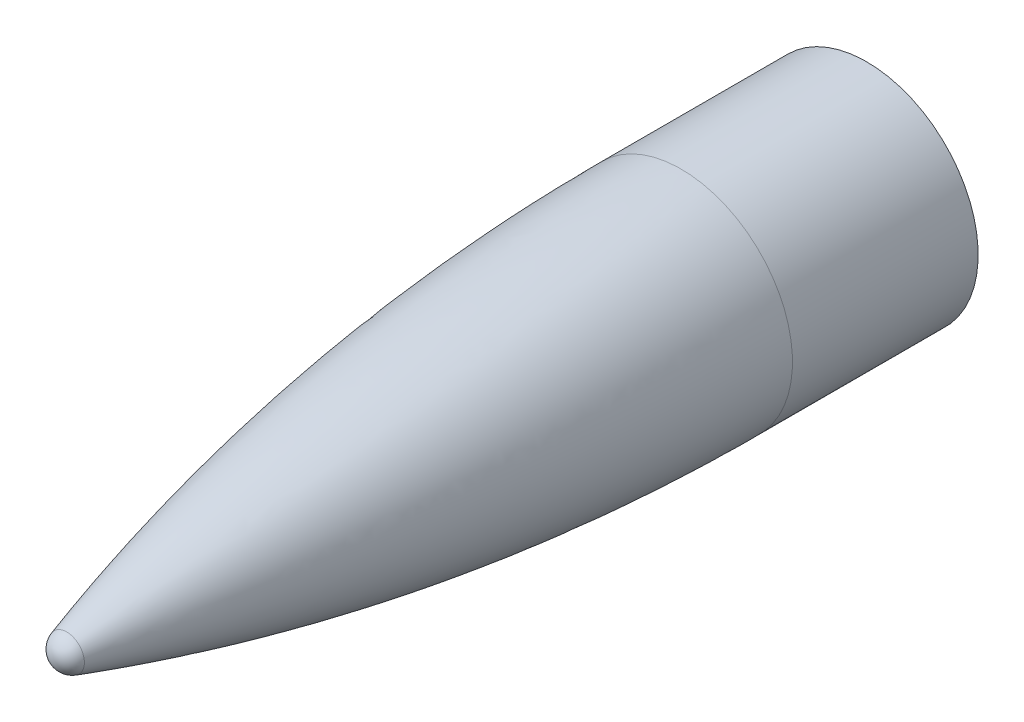
ISO-10303-21;
HEADER;
FILE_DESCRIPTION(('STEP AP214'),'2;1');
FILE_NAME('part.step','',(''),(''),'','','');
FILE_SCHEMA(('AUTOMOTIVE_DESIGN { 1 0 10303 214 1 1 1 1 }'));
ENDSEC;
DATA;
#1=APPLICATION_CONTEXT('core data for automotive mechanical design processes');
#2=APPLICATION_PROTOCOL_DEFINITION('international standard','automotive_design',2000,#1);
#3=PRODUCT_CONTEXT('',#1,'mechanical');
#4=PRODUCT('Part','Part','',(#3));
#5=PRODUCT_RELATED_PRODUCT_CATEGORY('part','',(#4));
#6=PRODUCT_DEFINITION_FORMATION('','',#4);
#7=PRODUCT_DEFINITION_CONTEXT('part definition',#1,'design');
#8=PRODUCT_DEFINITION('design','',#6,#7);
#9=PRODUCT_DEFINITION_SHAPE('','',#8);
#10=(LENGTH_UNIT() NAMED_UNIT(*) SI_UNIT(.MILLI.,.METRE.));
#11=(NAMED_UNIT(*) PLANE_ANGLE_UNIT() SI_UNIT($,.RADIAN.));
#12=(NAMED_UNIT(*) SI_UNIT($,.STERADIAN.) SOLID_ANGLE_UNIT());
#13=UNCERTAINTY_MEASURE_WITH_UNIT(LENGTH_MEASURE(1.E-05),#10,'distance_accuracy_value','');
#14=(GEOMETRIC_REPRESENTATION_CONTEXT(3) GLOBAL_UNCERTAINTY_ASSIGNED_CONTEXT((#13)) GLOBAL_UNIT_ASSIGNED_CONTEXT((#10,
#11,#12)) REPRESENTATION_CONTEXT('',''));
#15=CARTESIAN_POINT('',(0.,0.,0.));
#16=DIRECTION('',(0.,0.,1.));
#17=DIRECTION('',(1.,0.,0.));
#18=AXIS2_PLACEMENT_3D('',#15,#16,#17);
#19=CARTESIAN_POINT('',(0.,76.200000000007,-457.199999999907));
#20=CARTESIAN_POINT('',(0.,76.2000000000069,-456.670024688339));
#21=CARTESIAN_POINT('',(0.,76.199237425893,-455.60785075579));
#22=CARTESIAN_POINT('',(0.,76.1958058423823,-453.222017869095));
#23=CARTESIAN_POINT('',(0.,76.1866549678693,-450.901590679719));
#24=CARTESIAN_POINT('',(0.,76.1729286932269,-448.296330314898));
#25=CARTESIAN_POINT('',(0.,76.1546270630047,-445.776253824505));
#26=CARTESIAN_POINT('',(0.,76.1317501366053,-443.230260365808));
#27=CARTESIAN_POINT('',(0.,76.1042979882795,-440.693049904393));
#28=CARTESIAN_POINT('',(0.,76.0722707071038,-438.152678190926));
#29=CARTESIAN_POINT('',(0.,76.0356683970187,-435.61358408861));
#30=CARTESIAN_POINT('',(0.,75.9841968717504,-432.439264090638));
#31=CARTESIAN_POINT('',(0.,75.9132814884853,-428.63045966813));
#32=CARTESIAN_POINT('',(0.,75.8172044263522,-424.186997047916));
#33=CARTESIAN_POINT('',(0.,75.6891052790113,-419.109253724075));
#34=CARTESIAN_POINT('',(0.,75.5427110034815,-414.031967532462));
#35=CARTESIAN_POINT('',(0.,75.3780234997603,-408.955262717205));
#36=CARTESIAN_POINT('',(0.,75.1950449052664,-403.879172542934));
#37=CARTESIAN_POINT('',(0.,74.8428271354973,-394.997236841003));
#38=CARTESIAN_POINT('',(0.,73.4157901641889,-364.553965009971));
#39=CARTESIAN_POINT('',(0.,69.5415131235084,-312.619254534846));
#40=CARTESIAN_POINT('',(0.,62.3983931546421,-254.603581030365));
#41=CARTESIAN_POINT('',(0.,51.9052496486583,-194.540262791638));
#42=CARTESIAN_POINT('',(0.,43.4742388229458,-154.786289185726));
#43=CARTESIAN_POINT('',(0.,38.9253087952496,-134.983821777101));
#44=CARTESIAN_POINT('',(0.,35.6347240165441,-121.40853303888));
#45=CARTESIAN_POINT('',(0.,33.7954381370103,-114.014789381299));
#46=CARTESIAN_POINT('',(0.,31.9206465560665,-106.629952216038));
#47=CARTESIAN_POINT('',(0.,30.0104137717513,-99.2542522269939));
#48=CARTESIAN_POINT('',(0.,27.7301247501993,-90.6626458542886));
#49=CARTESIAN_POINT('',(0.,25.0534602653176,-80.8629253618494));
#50=CARTESIAN_POINT('',(0.,22.6495479816838,-72.3049535097716));
#51=CARTESIAN_POINT('',(0.,20.5451986581388,-64.9825677272437));
#52=CARTESIAN_POINT('',(0.,18.7620404658644,-58.8883150864249));
#53=CARTESIAN_POINT('',(0.,17.3184350310693,-54.0196122631995));
#54=CARTESIAN_POINT('',(0.,16.1302473743045,-50.0648123228897));
#55=CARTESIAN_POINT('',(0.,15.2099031052502,-47.0310918097235));
#56=CARTESIAN_POINT('',(0.,14.4663085009522,-44.5960260552163));
#57=CARTESIAN_POINT('',(0.,13.9006819897347,-42.7520044786671));
#58=CARTESIAN_POINT('',(0.,13.3047716566379,-40.8167562175844));
#59=CARTESIAN_POINT('',(0.,12.596904039278,-38.5383185593141));
#60=CARTESIAN_POINT('',(0.,12.2806946473213,-37.5231090604634));
#61=CARTESIAN_POINT('',(0.,12.1227272738779,-37.017223289661));
#62=B_SPLINE_CURVE_WITH_KNOTS('',4,(#19,#20,#21,#22,#23,#24,#25,#26,#27,#28,#29,#30,#31,#32,#33,
#34,#35,#36,#37,#38,#39,#40,#41,#42,#43,#44,#45,#46,#47,#48,#49,#50,#51,#52,#53,#54,#55,#56,#57,
#58,#59,#60,#61),.UNSPECIFIED.,.F.,.F.,(5,1,1,1,1,1,1,1,1,1,1,1,1,1,1,1,1,1,1,1,1,1,1,1,1,1,1,1,
1,1,1,1,1,1,1,1,1,1,1,5),(0.0830753889023374,0.0880439008173935,0.0930124127324497,
0.0979809246475058,0.102949436562562,0.107917948477618,0.112886460392674,0.11785497230773,
0.122823484222786,0.127791996152764,0.132760508082742,0.142697531942697,0.152634555802652,
0.162571579662608,0.172508603932912,0.182445628203215,0.192382652473519,0.202319676743823,
0.242067770049385,0.420934201057256,0.599800627703216,0.659422776373348,0.719044913140643,
0.738918961000814,0.758793008860985,0.768730035043652,0.778667061226319,0.798541113591653,
0.818415156707334,0.838289199823016,0.85816324657262,0.868100269947421,0.878037293322223,
0.887974322004401,0.897911350686579,0.900395607857124,0.902879865027668,0.907848379368757,
0.912816893709846,0.917785408050935),.UNSPECIFIED.);
#63=CARTESIAN_POINT('',(0.,0.,-480.059999999982));
#64=DIRECTION('',(0.,0.,-1.));
#65=AXIS1_PLACEMENT('',#63,#64);
#66=SURFACE_OF_REVOLUTION('',#62,#65);
#67=CARTESIAN_POINT('',(0.,0.,-37.0172232878184));
#68=DIRECTION('',(0.,0.,-1.));
#69=DIRECTION('',(-1.,0.,0.));
#70=AXIS2_PLACEMENT_3D('',#67,#68,#69);
#71=CIRCLE('',#70,12.1227272733026);
#72=CARTESIAN_POINT('',(-12.1227272733026,0.,-37.0172232878184));
#73=VERTEX_POINT('',#72);
#74=EDGE_CURVE('E10',#73,#73,#71,.T.);
#75=ORIENTED_EDGE('',*,*,#74,.T.);
#76=EDGE_LOOP('',(#75));
#77=FACE_BOUND('',#76,.T.);
#78=CARTESIAN_POINT('',(0.,0.,-457.199999999953));
#79=DIRECTION('',(0.,0.,-1.));
#80=DIRECTION('',(-1.,0.,0.));
#81=AXIS2_PLACEMENT_3D('',#78,#79,#80);
#82=CIRCLE('',#81,76.2);
#83=CARTESIAN_POINT('',(-76.2,0.,-457.199999999953));
#84=VERTEX_POINT('',#83);
#85=EDGE_CURVE('E47',#84,#84,#82,.T.);
#86=ORIENTED_EDGE('',*,*,#85,.F.);
#87=EDGE_LOOP('',(#86));
#88=FACE_BOUND('',#87,.T.);
#89=ADVANCED_FACE('F39',(#77,#88),#66,.F.);
#90=CARTESIAN_POINT('',(0.,5.67901628500955E-10,-40.8026537086417));
#91=DIRECTION('',(0.,0.,-1.));
#92=DIRECTION('',(0.,1.,0.));
#93=AXIS2_PLACEMENT_3D('',#90,#91,#92);
#94=SPHERICAL_SURFACE('',#93,12.7);
#95=ORIENTED_EDGE('',*,*,#74,.F.);
#96=EDGE_LOOP('',(#95));
#97=FACE_BOUND('',#96,.T.);
#98=ADVANCED_FACE('F70',(#97),#94,.T.);
#99=CARTESIAN_POINT('',(0.,0.,-584.199999999953));
#100=DIRECTION('',(0.,0.,1.));
#101=DIRECTION('',(1.,0.,0.));
#102=AXIS2_PLACEMENT_3D('',#99,#100,#101);
#103=CYLINDRICAL_SURFACE('',#102,76.2);
#104=CARTESIAN_POINT('',(0.,0.,-584.199999999953));
#105=DIRECTION('',(0.,0.,-1.));
#106=DIRECTION('',(-1.,0.,0.));
#107=AXIS2_PLACEMENT_3D('',#104,#105,#106);
#108=CIRCLE('',#107,76.2);
#109=CARTESIAN_POINT('',(-76.2,0.,-584.199999999953));
#110=VERTEX_POINT('',#109);
#111=EDGE_CURVE('E52',#110,#110,#108,.T.);
#112=ORIENTED_EDGE('',*,*,#111,.F.);
#113=EDGE_LOOP('',(#112));
#114=FACE_BOUND('',#113,.T.);
#115=ORIENTED_EDGE('',*,*,#85,.T.);
#116=EDGE_LOOP('',(#115));
#117=FACE_BOUND('',#116,.T.);
#118=ADVANCED_FACE('F68',(#114,#117),#103,.T.);
#119=CARTESIAN_POINT('',(0.,0.,-584.199999999953));
#120=DIRECTION('',(0.,0.,-1.));
#121=DIRECTION('',(-1.,0.,0.));
#122=AXIS2_PLACEMENT_3D('',#119,#120,#121);
#123=PLANE('',#122);
#124=ORIENTED_EDGE('',*,*,#111,.T.);
#125=EDGE_LOOP('',(#124));
#126=FACE_BOUND('',#125,.T.);
#127=ADVANCED_FACE('F66',(#126),#123,.T.);
#128=CLOSED_SHELL('',(#89,#98,#118,#127));
#129=MANIFOLD_SOLID_BREP('B2',#128);
#130=ADVANCED_BREP_SHAPE_REPRESENTATION('',(#18,#129),#14);
#131=SHAPE_DEFINITION_REPRESENTATION(#9,#130);
ENDSEC;
END-ISO-10303-21;
